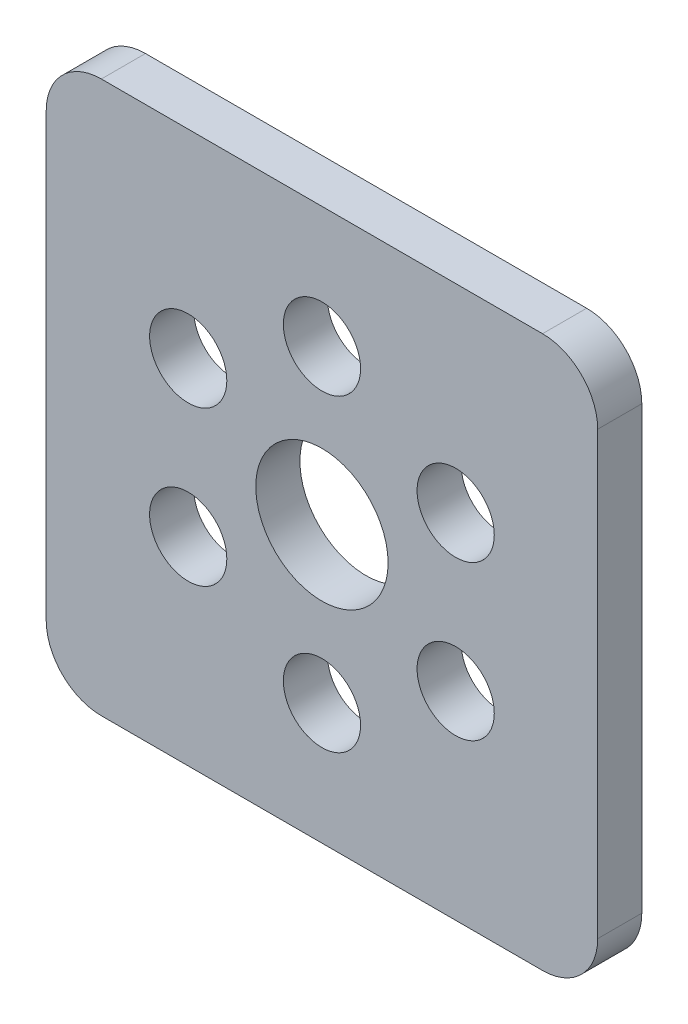
ISO-10303-21;
HEADER;
FILE_DESCRIPTION(('STEP AP214'),'2;1');
FILE_NAME('part.step','',(''),(''),'','','');
FILE_SCHEMA(('AUTOMOTIVE_DESIGN { 1 0 10303 214 1 1 1 1 }'));
ENDSEC;
DATA;
#1=APPLICATION_CONTEXT('core data for automotive mechanical design processes');
#2=APPLICATION_PROTOCOL_DEFINITION('international standard','automotive_design',2000,#1);
#3=PRODUCT_CONTEXT('',#1,'mechanical');
#4=PRODUCT('Part','Part','',(#3));
#5=PRODUCT_RELATED_PRODUCT_CATEGORY('part','',(#4));
#6=PRODUCT_DEFINITION_FORMATION('','',#4);
#7=PRODUCT_DEFINITION_CONTEXT('part definition',#1,'design');
#8=PRODUCT_DEFINITION('design','',#6,#7);
#9=PRODUCT_DEFINITION_SHAPE('','',#8);
#10=(LENGTH_UNIT() NAMED_UNIT(*) SI_UNIT(.MILLI.,.METRE.));
#11=(NAMED_UNIT(*) PLANE_ANGLE_UNIT() SI_UNIT($,.RADIAN.));
#12=(NAMED_UNIT(*) SI_UNIT($,.STERADIAN.) SOLID_ANGLE_UNIT());
#13=UNCERTAINTY_MEASURE_WITH_UNIT(LENGTH_MEASURE(1.E-05),#10,'distance_accuracy_value','');
#14=(GEOMETRIC_REPRESENTATION_CONTEXT(3) GLOBAL_UNCERTAINTY_ASSIGNED_CONTEXT((#13)) GLOBAL_UNIT_ASSIGNED_CONTEXT((#10,
#11,#12)) REPRESENTATION_CONTEXT('',''));
#15=CARTESIAN_POINT('',(0.,0.,0.));
#16=DIRECTION('',(0.,0.,1.));
#17=DIRECTION('',(1.,0.,0.));
#18=AXIS2_PLACEMENT_3D('',#15,#16,#17);
#19=CARTESIAN_POINT('',(0.,0.,4.));
#20=DIRECTION('',(0.,0.,-1.));
#21=DIRECTION('',(-1.,0.,0.));
#22=AXIS2_PLACEMENT_3D('',#19,#20,#21);
#23=PLANE('',#22);
#24=DIRECTION('',(1.,0.,0.));
#25=VECTOR('',#24,1.);
#26=CARTESIAN_POINT('',(25.,-25.,4.));
#27=LINE('',#26,#25);
#28=CARTESIAN_POINT('',(-20.,-25.,4.));
#29=VERTEX_POINT('',#28);
#30=CARTESIAN_POINT('',(20.,-25.,4.));
#31=VERTEX_POINT('',#30);
#32=EDGE_CURVE('E170',#29,#31,#27,.T.);
#33=ORIENTED_EDGE('',*,*,#32,.T.);
#34=CARTESIAN_POINT('',(20.,-20.,4.));
#35=DIRECTION('',(0.,0.,-1.));
#36=DIRECTION('',(-1.,0.,0.));
#37=AXIS2_PLACEMENT_3D('',#34,#35,#36);
#38=CIRCLE('',#37,5.);
#39=CARTESIAN_POINT('',(25.,-20.,4.));
#40=VERTEX_POINT('',#39);
#41=EDGE_CURVE('E148',#31,#40,#38,.F.);
#42=ORIENTED_EDGE('',*,*,#41,.T.);
#43=DIRECTION('',(0.,1.,0.));
#44=VECTOR('',#43,1.);
#45=CARTESIAN_POINT('',(25.,25.,4.));
#46=LINE('',#45,#44);
#47=CARTESIAN_POINT('',(25.,20.,4.));
#48=VERTEX_POINT('',#47);
#49=EDGE_CURVE('E118',#40,#48,#46,.T.);
#50=ORIENTED_EDGE('',*,*,#49,.T.);
#51=CARTESIAN_POINT('',(20.,20.,4.));
#52=DIRECTION('',(0.,0.,-1.));
#53=DIRECTION('',(-1.,0.,0.));
#54=AXIS2_PLACEMENT_3D('',#51,#52,#53);
#55=CIRCLE('',#54,5.);
#56=CARTESIAN_POINT('',(20.,25.,4.));
#57=VERTEX_POINT('',#56);
#58=EDGE_CURVE('E54',#48,#57,#55,.F.);
#59=ORIENTED_EDGE('',*,*,#58,.T.);
#60=DIRECTION('',(-1.,0.,0.));
#61=VECTOR('',#60,1.);
#62=CARTESIAN_POINT('',(25.,25.,4.));
#63=LINE('',#62,#61);
#64=CARTESIAN_POINT('',(-20.,25.,4.));
#65=VERTEX_POINT('',#64);
#66=EDGE_CURVE('E134',#57,#65,#63,.T.);
#67=ORIENTED_EDGE('',*,*,#66,.T.);
#68=CARTESIAN_POINT('',(-20.,20.,4.));
#69=DIRECTION('',(0.,0.,-1.));
#70=DIRECTION('',(-1.,0.,0.));
#71=AXIS2_PLACEMENT_3D('',#68,#69,#70);
#72=CIRCLE('',#71,5.);
#73=CARTESIAN_POINT('',(-25.,20.,4.));
#74=VERTEX_POINT('',#73);
#75=EDGE_CURVE('E144',#65,#74,#72,.F.);
#76=ORIENTED_EDGE('',*,*,#75,.T.);
#77=DIRECTION('',(0.,-1.,0.));
#78=VECTOR('',#77,1.);
#79=CARTESIAN_POINT('',(-25.,25.,4.));
#80=LINE('',#79,#78);
#81=CARTESIAN_POINT('',(-25.,-20.,4.));
#82=VERTEX_POINT('',#81);
#83=EDGE_CURVE('E128',#74,#82,#80,.T.);
#84=ORIENTED_EDGE('',*,*,#83,.T.);
#85=CARTESIAN_POINT('',(-20.,-20.,4.));
#86=DIRECTION('',(0.,0.,-1.));
#87=DIRECTION('',(-1.,0.,0.));
#88=AXIS2_PLACEMENT_3D('',#85,#86,#87);
#89=CIRCLE('',#88,5.);
#90=EDGE_CURVE('E146',#82,#29,#89,.F.);
#91=ORIENTED_EDGE('',*,*,#90,.T.);
#92=EDGE_LOOP('',(#33,#42,#50,#59,#67,#76,#84,#91));
#93=FACE_BOUND('',#92,.T.);
#94=CARTESIAN_POINT('',(0.,14.,4.));
#95=DIRECTION('',(0.,0.,1.));
#96=DIRECTION('',(1.,0.,0.));
#97=AXIS2_PLACEMENT_3D('',#94,#95,#96);
#98=CIRCLE('',#97,3.5);
#99=CARTESIAN_POINT('',(3.5,14.,4.));
#100=VERTEX_POINT('',#99);
#101=EDGE_CURVE('E179',#100,#100,#98,.T.);
#102=ORIENTED_EDGE('',*,*,#101,.F.);
#103=EDGE_LOOP('',(#102));
#104=FACE_BOUND('',#103,.T.);
#105=CARTESIAN_POINT('',(0.,0.,4.));
#106=DIRECTION('',(0.,0.,1.));
#107=DIRECTION('',(1.,0.,0.));
#108=AXIS2_PLACEMENT_3D('',#105,#106,#107);
#109=CIRCLE('',#108,6.);
#110=CARTESIAN_POINT('',(6.,0.,4.));
#111=VERTEX_POINT('',#110);
#112=EDGE_CURVE('E184',#111,#111,#109,.T.);
#113=ORIENTED_EDGE('',*,*,#112,.F.);
#114=EDGE_LOOP('',(#113));
#115=FACE_BOUND('',#114,.T.);
#116=CARTESIAN_POINT('',(12.1243556529825,7.00000000000069,4.));
#117=DIRECTION('',(0.,0.,1.));
#118=DIRECTION('',(1.,0.,0.));
#119=AXIS2_PLACEMENT_3D('',#116,#117,#118);
#120=CIRCLE('',#119,3.5);
#121=CARTESIAN_POINT('',(15.6243556529825,7.00000000000069,4.));
#122=VERTEX_POINT('',#121);
#123=EDGE_CURVE('E189',#122,#122,#120,.T.);
#124=ORIENTED_EDGE('',*,*,#123,.F.);
#125=EDGE_LOOP('',(#124));
#126=FACE_BOUND('',#125,.T.);
#127=CARTESIAN_POINT('',(12.1243556529833,-6.99999999999931,4.));
#128=DIRECTION('',(0.,0.,1.));
#129=DIRECTION('',(1.,0.,0.));
#130=AXIS2_PLACEMENT_3D('',#127,#128,#129);
#131=CIRCLE('',#130,3.5);
#132=CARTESIAN_POINT('',(15.6243556529833,-6.99999999999931,4.));
#133=VERTEX_POINT('',#132);
#134=EDGE_CURVE('E195',#133,#133,#131,.T.);
#135=ORIENTED_EDGE('',*,*,#134,.F.);
#136=EDGE_LOOP('',(#135));
#137=FACE_BOUND('',#136,.T.);
#138=CARTESIAN_POINT('',(1.58818671706501E-12,-14.,4.));
#139=DIRECTION('',(0.,0.,1.));
#140=DIRECTION('',(1.,0.,0.));
#141=AXIS2_PLACEMENT_3D('',#138,#139,#140);
#142=CIRCLE('',#141,3.5);
#143=CARTESIAN_POINT('',(3.50000000000159,-14.,4.));
#144=VERTEX_POINT('',#143);
#145=EDGE_CURVE('E201',#144,#144,#142,.T.);
#146=ORIENTED_EDGE('',*,*,#145,.F.);
#147=EDGE_LOOP('',(#146));
#148=FACE_BOUND('',#147,.T.);
#149=CARTESIAN_POINT('',(-12.1243556529809,-7.00000000000069,4.));
#150=DIRECTION('',(0.,0.,1.));
#151=DIRECTION('',(1.,0.,0.));
#152=AXIS2_PLACEMENT_3D('',#149,#150,#151);
#153=CIRCLE('',#152,3.5);
#154=CARTESIAN_POINT('',(-8.62435565298095,-7.00000000000069,4.));
#155=VERTEX_POINT('',#154);
#156=EDGE_CURVE('E207',#155,#155,#153,.T.);
#157=ORIENTED_EDGE('',*,*,#156,.F.);
#158=EDGE_LOOP('',(#157));
#159=FACE_BOUND('',#158,.T.);
#160=CARTESIAN_POINT('',(-12.1243556529817,6.9999999999993,4.));
#161=DIRECTION('',(0.,0.,1.));
#162=DIRECTION('',(1.,0.,0.));
#163=AXIS2_PLACEMENT_3D('',#160,#161,#162);
#164=CIRCLE('',#163,3.5);
#165=CARTESIAN_POINT('',(-8.62435565298175,6.9999999999993,4.));
#166=VERTEX_POINT('',#165);
#167=EDGE_CURVE('E213',#166,#166,#164,.T.);
#168=ORIENTED_EDGE('',*,*,#167,.F.);
#169=EDGE_LOOP('',(#168));
#170=FACE_BOUND('',#169,.T.);
#171=ADVANCED_FACE('F34',(#93,#104,#115,#126,#137,#148,#159,#170),#23,.F.);
#172=CARTESIAN_POINT('',(0.,0.,0.));
#173=DIRECTION('',(0.,0.,-1.));
#174=DIRECTION('',(-1.,0.,0.));
#175=AXIS2_PLACEMENT_3D('',#172,#173,#174);
#176=PLANE('',#175);
#177=CARTESIAN_POINT('',(-12.1243556529809,-7.00000000000069,0.));
#178=DIRECTION('',(0.,0.,1.));
#179=DIRECTION('',(1.,0.,0.));
#180=AXIS2_PLACEMENT_3D('',#177,#178,#179);
#181=CIRCLE('',#180,3.5);
#182=CARTESIAN_POINT('',(-8.62435565298095,-7.00000000000069,0.));
#183=VERTEX_POINT('',#182);
#184=EDGE_CURVE('E210',#183,#183,#181,.T.);
#185=ORIENTED_EDGE('',*,*,#184,.T.);
#186=EDGE_LOOP('',(#185));
#187=FACE_BOUND('',#186,.T.);
#188=CARTESIAN_POINT('',(12.1243556529833,-6.99999999999931,0.));
#189=DIRECTION('',(0.,0.,1.));
#190=DIRECTION('',(1.,0.,0.));
#191=AXIS2_PLACEMENT_3D('',#188,#189,#190);
#192=CIRCLE('',#191,3.5);
#193=CARTESIAN_POINT('',(15.6243556529833,-6.99999999999931,0.));
#194=VERTEX_POINT('',#193);
#195=EDGE_CURVE('E198',#194,#194,#192,.T.);
#196=ORIENTED_EDGE('',*,*,#195,.T.);
#197=EDGE_LOOP('',(#196));
#198=FACE_BOUND('',#197,.T.);
#199=CARTESIAN_POINT('',(0.,0.,0.));
#200=DIRECTION('',(0.,0.,1.));
#201=DIRECTION('',(1.,0.,0.));
#202=AXIS2_PLACEMENT_3D('',#199,#200,#201);
#203=CIRCLE('',#202,6.);
#204=CARTESIAN_POINT('',(6.,0.,0.));
#205=VERTEX_POINT('',#204);
#206=EDGE_CURVE('E186',#205,#205,#203,.T.);
#207=ORIENTED_EDGE('',*,*,#206,.T.);
#208=EDGE_LOOP('',(#207));
#209=FACE_BOUND('',#208,.T.);
#210=DIRECTION('',(0.,1.,0.));
#211=VECTOR('',#210,1.);
#212=CARTESIAN_POINT('',(25.,25.,0.));
#213=LINE('',#212,#211);
#214=CARTESIAN_POINT('',(25.,-20.,0.));
#215=VERTEX_POINT('',#214);
#216=CARTESIAN_POINT('',(25.,20.,0.));
#217=VERTEX_POINT('',#216);
#218=EDGE_CURVE('E116',#215,#217,#213,.T.);
#219=ORIENTED_EDGE('',*,*,#218,.F.);
#220=CARTESIAN_POINT('',(20.,-20.,0.));
#221=DIRECTION('',(0.,0.,-1.));
#222=DIRECTION('',(-1.,0.,0.));
#223=AXIS2_PLACEMENT_3D('',#220,#221,#222);
#224=CIRCLE('',#223,5.);
#225=CARTESIAN_POINT('',(20.,-25.,0.));
#226=VERTEX_POINT('',#225);
#227=EDGE_CURVE('E99',#215,#226,#224,.T.);
#228=ORIENTED_EDGE('',*,*,#227,.T.);
#229=DIRECTION('',(1.,0.,0.));
#230=VECTOR('',#229,1.);
#231=CARTESIAN_POINT('',(25.,-25.,0.));
#232=LINE('',#231,#230);
#233=CARTESIAN_POINT('',(-20.,-25.,0.));
#234=VERTEX_POINT('',#233);
#235=EDGE_CURVE('E126',#234,#226,#232,.T.);
#236=ORIENTED_EDGE('',*,*,#235,.F.);
#237=CARTESIAN_POINT('',(-20.,-20.,0.));
#238=DIRECTION('',(0.,0.,-1.));
#239=DIRECTION('',(-1.,0.,0.));
#240=AXIS2_PLACEMENT_3D('',#237,#238,#239);
#241=CIRCLE('',#240,5.);
#242=CARTESIAN_POINT('',(-25.,-20.,0.));
#243=VERTEX_POINT('',#242);
#244=EDGE_CURVE('E110',#234,#243,#241,.T.);
#245=ORIENTED_EDGE('',*,*,#244,.T.);
#246=DIRECTION('',(0.,-1.,0.));
#247=VECTOR('',#246,1.);
#248=CARTESIAN_POINT('',(-25.,25.,0.));
#249=LINE('',#248,#247);
#250=CARTESIAN_POINT('',(-25.,20.,0.));
#251=VERTEX_POINT('',#250);
#252=EDGE_CURVE('E130',#251,#243,#249,.T.);
#253=ORIENTED_EDGE('',*,*,#252,.F.);
#254=CARTESIAN_POINT('',(-20.,20.,0.));
#255=DIRECTION('',(0.,0.,-1.));
#256=DIRECTION('',(-1.,0.,0.));
#257=AXIS2_PLACEMENT_3D('',#254,#255,#256);
#258=CIRCLE('',#257,5.);
#259=CARTESIAN_POINT('',(-20.,25.,0.));
#260=VERTEX_POINT('',#259);
#261=EDGE_CURVE('E137',#251,#260,#258,.T.);
#262=ORIENTED_EDGE('',*,*,#261,.T.);
#263=DIRECTION('',(-1.,0.,0.));
#264=VECTOR('',#263,1.);
#265=CARTESIAN_POINT('',(25.,25.,0.));
#266=LINE('',#265,#264);
#267=CARTESIAN_POINT('',(20.,25.,0.));
#268=VERTEX_POINT('',#267);
#269=EDGE_CURVE('E125',#268,#260,#266,.T.);
#270=ORIENTED_EDGE('',*,*,#269,.F.);
#271=CARTESIAN_POINT('',(20.,20.,0.));
#272=DIRECTION('',(0.,0.,-1.));
#273=DIRECTION('',(-1.,0.,0.));
#274=AXIS2_PLACEMENT_3D('',#271,#272,#273);
#275=CIRCLE('',#274,5.);
#276=EDGE_CURVE('E119',#268,#217,#275,.T.);
#277=ORIENTED_EDGE('',*,*,#276,.T.);
#278=EDGE_LOOP('',(#219,#228,#236,#245,#253,#262,#270,#277));
#279=FACE_BOUND('',#278,.T.);
#280=CARTESIAN_POINT('',(0.,14.,0.));
#281=DIRECTION('',(0.,0.,1.));
#282=DIRECTION('',(1.,0.,0.));
#283=AXIS2_PLACEMENT_3D('',#280,#281,#282);
#284=CIRCLE('',#283,3.5);
#285=CARTESIAN_POINT('',(3.5,14.,0.));
#286=VERTEX_POINT('',#285);
#287=EDGE_CURVE('E175',#286,#286,#284,.T.);
#288=ORIENTED_EDGE('',*,*,#287,.T.);
#289=EDGE_LOOP('',(#288));
#290=FACE_BOUND('',#289,.T.);
#291=CARTESIAN_POINT('',(12.1243556529825,7.00000000000069,0.));
#292=DIRECTION('',(0.,0.,1.));
#293=DIRECTION('',(1.,0.,0.));
#294=AXIS2_PLACEMENT_3D('',#291,#292,#293);
#295=CIRCLE('',#294,3.5);
#296=CARTESIAN_POINT('',(15.6243556529825,7.00000000000069,0.));
#297=VERTEX_POINT('',#296);
#298=EDGE_CURVE('E192',#297,#297,#295,.T.);
#299=ORIENTED_EDGE('',*,*,#298,.T.);
#300=EDGE_LOOP('',(#299));
#301=FACE_BOUND('',#300,.T.);
#302=CARTESIAN_POINT('',(1.58818671706501E-12,-14.,0.));
#303=DIRECTION('',(0.,0.,1.));
#304=DIRECTION('',(1.,0.,0.));
#305=AXIS2_PLACEMENT_3D('',#302,#303,#304);
#306=CIRCLE('',#305,3.5);
#307=CARTESIAN_POINT('',(3.50000000000159,-14.,0.));
#308=VERTEX_POINT('',#307);
#309=EDGE_CURVE('E204',#308,#308,#306,.T.);
#310=ORIENTED_EDGE('',*,*,#309,.T.);
#311=EDGE_LOOP('',(#310));
#312=FACE_BOUND('',#311,.T.);
#313=CARTESIAN_POINT('',(-12.1243556529817,6.9999999999993,0.));
#314=DIRECTION('',(0.,0.,1.));
#315=DIRECTION('',(1.,0.,0.));
#316=AXIS2_PLACEMENT_3D('',#313,#314,#315);
#317=CIRCLE('',#316,3.5);
#318=CARTESIAN_POINT('',(-8.62435565298175,6.9999999999993,0.));
#319=VERTEX_POINT('',#318);
#320=EDGE_CURVE('E216',#319,#319,#317,.T.);
#321=ORIENTED_EDGE('',*,*,#320,.T.);
#322=EDGE_LOOP('',(#321));
#323=FACE_BOUND('',#322,.T.);
#324=ADVANCED_FACE('F122',(#187,#198,#209,#279,#290,#301,#312,#323),#176,.T.);
#325=CARTESIAN_POINT('',(-25.,25.,4.));
#326=DIRECTION('',(1.,0.,0.));
#327=DIRECTION('',(0.,0.,-1.));
#328=AXIS2_PLACEMENT_3D('',#325,#326,#327);
#329=PLANE('',#328);
#330=ORIENTED_EDGE('',*,*,#252,.T.);
#331=DIRECTION('',(0.,0.,-1.));
#332=VECTOR('',#331,1.);
#333=CARTESIAN_POINT('',(-25.,-20.,4.));
#334=LINE('',#333,#332);
#335=EDGE_CURVE('E153',#243,#82,#334,.F.);
#336=ORIENTED_EDGE('',*,*,#335,.T.);
#337=ORIENTED_EDGE('',*,*,#83,.F.);
#338=DIRECTION('',(0.,0.,-1.));
#339=VECTOR('',#338,1.);
#340=CARTESIAN_POINT('',(-25.,20.,4.));
#341=LINE('',#340,#339);
#342=EDGE_CURVE('E150',#74,#251,#341,.T.);
#343=ORIENTED_EDGE('',*,*,#342,.T.);
#344=EDGE_LOOP('',(#330,#336,#337,#343));
#345=FACE_BOUND('',#344,.T.);
#346=ADVANCED_FACE('F166',(#345),#329,.F.);
#347=CARTESIAN_POINT('',(25.,-25.,4.));
#348=DIRECTION('',(0.,1.,0.));
#349=DIRECTION('',(0.,0.,1.));
#350=AXIS2_PLACEMENT_3D('',#347,#348,#349);
#351=PLANE('',#350);
#352=ORIENTED_EDGE('',*,*,#235,.T.);
#353=DIRECTION('',(0.,0.,-1.));
#354=VECTOR('',#353,1.);
#355=CARTESIAN_POINT('',(20.,-25.,4.));
#356=LINE('',#355,#354);
#357=EDGE_CURVE('E104',#226,#31,#356,.F.);
#358=ORIENTED_EDGE('',*,*,#357,.T.);
#359=ORIENTED_EDGE('',*,*,#32,.F.);
#360=DIRECTION('',(0.,0.,-1.));
#361=VECTOR('',#360,1.);
#362=CARTESIAN_POINT('',(-20.,-25.,4.));
#363=LINE('',#362,#361);
#364=EDGE_CURVE('E109',#29,#234,#363,.T.);
#365=ORIENTED_EDGE('',*,*,#364,.T.);
#366=EDGE_LOOP('',(#352,#358,#359,#365));
#367=FACE_BOUND('',#366,.T.);
#368=ADVANCED_FACE('F241',(#367),#351,.F.);
#369=CARTESIAN_POINT('',(25.,25.,4.));
#370=DIRECTION('',(-1.,0.,0.));
#371=DIRECTION('',(0.,0.,1.));
#372=AXIS2_PLACEMENT_3D('',#369,#370,#371);
#373=PLANE('',#372);
#374=ORIENTED_EDGE('',*,*,#49,.F.);
#375=DIRECTION('',(0.,0.,-1.));
#376=VECTOR('',#375,1.);
#377=CARTESIAN_POINT('',(25.,-20.,4.));
#378=LINE('',#377,#376);
#379=EDGE_CURVE('E103',#40,#215,#378,.T.);
#380=ORIENTED_EDGE('',*,*,#379,.T.);
#381=ORIENTED_EDGE('',*,*,#218,.T.);
#382=DIRECTION('',(0.,0.,-1.));
#383=VECTOR('',#382,1.);
#384=CARTESIAN_POINT('',(25.,20.,4.));
#385=LINE('',#384,#383);
#386=EDGE_CURVE('E120',#217,#48,#385,.F.);
#387=ORIENTED_EDGE('',*,*,#386,.T.);
#388=EDGE_LOOP('',(#374,#380,#381,#387));
#389=FACE_BOUND('',#388,.T.);
#390=ADVANCED_FACE('F115',(#389),#373,.F.);
#391=CARTESIAN_POINT('',(25.,25.,4.));
#392=DIRECTION('',(0.,-1.,0.));
#393=DIRECTION('',(0.,0.,-1.));
#394=AXIS2_PLACEMENT_3D('',#391,#392,#393);
#395=PLANE('',#394);
#396=ORIENTED_EDGE('',*,*,#269,.T.);
#397=DIRECTION('',(0.,0.,-1.));
#398=VECTOR('',#397,1.);
#399=CARTESIAN_POINT('',(-20.,25.,4.));
#400=LINE('',#399,#398);
#401=EDGE_CURVE('E11',#260,#65,#400,.F.);
#402=ORIENTED_EDGE('',*,*,#401,.T.);
#403=ORIENTED_EDGE('',*,*,#66,.F.);
#404=DIRECTION('',(0.,0.,-1.));
#405=VECTOR('',#404,1.);
#406=CARTESIAN_POINT('',(20.,25.,4.));
#407=LINE('',#406,#405);
#408=EDGE_CURVE('E42',#57,#268,#407,.T.);
#409=ORIENTED_EDGE('',*,*,#408,.T.);
#410=EDGE_LOOP('',(#396,#402,#403,#409));
#411=FACE_BOUND('',#410,.T.);
#412=ADVANCED_FACE('F156',(#411),#395,.F.);
#413=CARTESIAN_POINT('',(0.,14.,4.));
#414=DIRECTION('',(0.,0.,-1.));
#415=DIRECTION('',(-1.,0.,0.));
#416=AXIS2_PLACEMENT_3D('',#413,#414,#415);
#417=CYLINDRICAL_SURFACE('',#416,3.5);
#418=ORIENTED_EDGE('',*,*,#101,.T.);
#419=EDGE_LOOP('',(#418));
#420=FACE_BOUND('',#419,.T.);
#421=ORIENTED_EDGE('',*,*,#287,.F.);
#422=EDGE_LOOP('',(#421));
#423=FACE_BOUND('',#422,.T.);
#424=ADVANCED_FACE('F234',(#420,#423),#417,.F.);
#425=CARTESIAN_POINT('',(0.,0.,4.));
#426=DIRECTION('',(0.,0.,-1.));
#427=DIRECTION('',(-1.,0.,0.));
#428=AXIS2_PLACEMENT_3D('',#425,#426,#427);
#429=CYLINDRICAL_SURFACE('',#428,6.);
#430=ORIENTED_EDGE('',*,*,#112,.T.);
#431=EDGE_LOOP('',(#430));
#432=FACE_BOUND('',#431,.T.);
#433=ORIENTED_EDGE('',*,*,#206,.F.);
#434=EDGE_LOOP('',(#433));
#435=FACE_BOUND('',#434,.T.);
#436=ADVANCED_FACE('F360',(#432,#435),#429,.F.);
#437=CARTESIAN_POINT('',(12.1243556529825,7.00000000000069,4.));
#438=DIRECTION('',(0.,0.,-1.));
#439=DIRECTION('',(-1.,0.,0.));
#440=AXIS2_PLACEMENT_3D('',#437,#438,#439);
#441=CYLINDRICAL_SURFACE('',#440,3.5);
#442=ORIENTED_EDGE('',*,*,#123,.T.);
#443=EDGE_LOOP('',(#442));
#444=FACE_BOUND('',#443,.T.);
#445=ORIENTED_EDGE('',*,*,#298,.F.);
#446=EDGE_LOOP('',(#445));
#447=FACE_BOUND('',#446,.T.);
#448=ADVANCED_FACE('F350',(#444,#447),#441,.F.);
#449=CARTESIAN_POINT('',(12.1243556529833,-6.99999999999931,4.));
#450=DIRECTION('',(0.,0.,-1.));
#451=DIRECTION('',(-1.,0.,0.));
#452=AXIS2_PLACEMENT_3D('',#449,#450,#451);
#453=CYLINDRICAL_SURFACE('',#452,3.5);
#454=ORIENTED_EDGE('',*,*,#134,.T.);
#455=EDGE_LOOP('',(#454));
#456=FACE_BOUND('',#455,.T.);
#457=ORIENTED_EDGE('',*,*,#195,.F.);
#458=EDGE_LOOP('',(#457));
#459=FACE_BOUND('',#458,.T.);
#460=ADVANCED_FACE('F340',(#456,#459),#453,.F.);
#461=CARTESIAN_POINT('',(1.58818671706501E-12,-14.,4.));
#462=DIRECTION('',(0.,0.,-1.));
#463=DIRECTION('',(-1.,0.,0.));
#464=AXIS2_PLACEMENT_3D('',#461,#462,#463);
#465=CYLINDRICAL_SURFACE('',#464,3.5);
#466=ORIENTED_EDGE('',*,*,#145,.T.);
#467=EDGE_LOOP('',(#466));
#468=FACE_BOUND('',#467,.T.);
#469=ORIENTED_EDGE('',*,*,#309,.F.);
#470=EDGE_LOOP('',(#469));
#471=FACE_BOUND('',#470,.T.);
#472=ADVANCED_FACE('F330',(#468,#471),#465,.F.);
#473=CARTESIAN_POINT('',(-12.1243556529809,-7.00000000000069,4.));
#474=DIRECTION('',(0.,0.,-1.));
#475=DIRECTION('',(-1.,0.,0.));
#476=AXIS2_PLACEMENT_3D('',#473,#474,#475);
#477=CYLINDRICAL_SURFACE('',#476,3.5);
#478=ORIENTED_EDGE('',*,*,#156,.T.);
#479=EDGE_LOOP('',(#478));
#480=FACE_BOUND('',#479,.T.);
#481=ORIENTED_EDGE('',*,*,#184,.F.);
#482=EDGE_LOOP('',(#481));
#483=FACE_BOUND('',#482,.T.);
#484=ADVANCED_FACE('F321',(#480,#483),#477,.F.);
#485=CARTESIAN_POINT('',(-12.1243556529817,6.9999999999993,4.));
#486=DIRECTION('',(0.,0.,-1.));
#487=DIRECTION('',(-1.,0.,0.));
#488=AXIS2_PLACEMENT_3D('',#485,#486,#487);
#489=CYLINDRICAL_SURFACE('',#488,3.5);
#490=ORIENTED_EDGE('',*,*,#167,.T.);
#491=EDGE_LOOP('',(#490));
#492=FACE_BOUND('',#491,.T.);
#493=ORIENTED_EDGE('',*,*,#320,.F.);
#494=EDGE_LOOP('',(#493));
#495=FACE_BOUND('',#494,.T.);
#496=ADVANCED_FACE('F222',(#492,#495),#489,.F.);
#497=CARTESIAN_POINT('',(20.,-20.,4.));
#498=DIRECTION('',(0.,0.,-1.));
#499=DIRECTION('',(-1.,0.,0.));
#500=AXIS2_PLACEMENT_3D('',#497,#498,#499);
#501=CYLINDRICAL_SURFACE('',#500,5.);
#502=ORIENTED_EDGE('',*,*,#41,.F.);
#503=ORIENTED_EDGE('',*,*,#357,.F.);
#504=ORIENTED_EDGE('',*,*,#227,.F.);
#505=ORIENTED_EDGE('',*,*,#379,.F.);
#506=EDGE_LOOP('',(#502,#503,#504,#505));
#507=FACE_BOUND('',#506,.T.);
#508=ADVANCED_FACE('F102',(#507),#501,.T.);
#509=CARTESIAN_POINT('',(-20.,-20.,4.));
#510=DIRECTION('',(0.,0.,-1.));
#511=DIRECTION('',(-1.,0.,0.));
#512=AXIS2_PLACEMENT_3D('',#509,#510,#511);
#513=CYLINDRICAL_SURFACE('',#512,5.);
#514=ORIENTED_EDGE('',*,*,#90,.F.);
#515=ORIENTED_EDGE('',*,*,#335,.F.);
#516=ORIENTED_EDGE('',*,*,#244,.F.);
#517=ORIENTED_EDGE('',*,*,#364,.F.);
#518=EDGE_LOOP('',(#514,#515,#516,#517));
#519=FACE_BOUND('',#518,.T.);
#520=ADVANCED_FACE('F249',(#519),#513,.T.);
#521=CARTESIAN_POINT('',(-20.,20.,4.));
#522=DIRECTION('',(0.,0.,-1.));
#523=DIRECTION('',(-1.,0.,0.));
#524=AXIS2_PLACEMENT_3D('',#521,#522,#523);
#525=CYLINDRICAL_SURFACE('',#524,5.);
#526=ORIENTED_EDGE('',*,*,#75,.F.);
#527=ORIENTED_EDGE('',*,*,#401,.F.);
#528=ORIENTED_EDGE('',*,*,#261,.F.);
#529=ORIENTED_EDGE('',*,*,#342,.F.);
#530=EDGE_LOOP('',(#526,#527,#528,#529));
#531=FACE_BOUND('',#530,.T.);
#532=ADVANCED_FACE('F163',(#531),#525,.T.);
#533=CARTESIAN_POINT('',(20.,20.,4.));
#534=DIRECTION('',(0.,0.,-1.));
#535=DIRECTION('',(-1.,0.,0.));
#536=AXIS2_PLACEMENT_3D('',#533,#534,#535);
#537=CYLINDRICAL_SURFACE('',#536,5.);
#538=ORIENTED_EDGE('',*,*,#58,.F.);
#539=ORIENTED_EDGE('',*,*,#386,.F.);
#540=ORIENTED_EDGE('',*,*,#276,.F.);
#541=ORIENTED_EDGE('',*,*,#408,.F.);
#542=EDGE_LOOP('',(#538,#539,#540,#541));
#543=FACE_BOUND('',#542,.T.);
#544=ADVANCED_FACE('F36',(#543),#537,.T.);
#545=CLOSED_SHELL('',(#171,#324,#346,#368,#390,#412,#424,#436,#448,#460,#472,#484,#496,#508,
#520,#532,#544));
#546=MANIFOLD_SOLID_BREP('B2',#545);
#547=ADVANCED_BREP_SHAPE_REPRESENTATION('',(#18,#546),#14);
#548=SHAPE_DEFINITION_REPRESENTATION(#9,#547);
ENDSEC;
END-ISO-10303-21;
